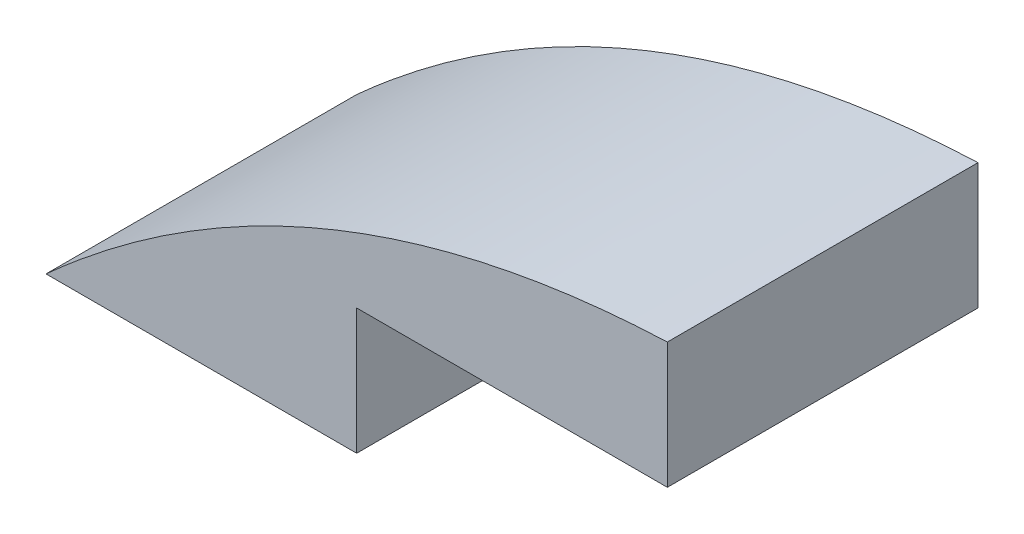
ISO-10303-21;
HEADER;
FILE_DESCRIPTION(('STEP AP214'),'2;1');
FILE_NAME('part.step','',(''),(''),'','','');
FILE_SCHEMA(('AUTOMOTIVE_DESIGN { 1 0 10303 214 1 1 1 1 }'));
ENDSEC;
DATA;
#1=APPLICATION_CONTEXT('core data for automotive mechanical design processes');
#2=APPLICATION_PROTOCOL_DEFINITION('international standard','automotive_design',2000,#1);
#3=PRODUCT_CONTEXT('',#1,'mechanical');
#4=PRODUCT('Part','Part','',(#3));
#5=PRODUCT_RELATED_PRODUCT_CATEGORY('part','',(#4));
#6=PRODUCT_DEFINITION_FORMATION('','',#4);
#7=PRODUCT_DEFINITION_CONTEXT('part definition',#1,'design');
#8=PRODUCT_DEFINITION('design','',#6,#7);
#9=PRODUCT_DEFINITION_SHAPE('','',#8);
#10=(LENGTH_UNIT() NAMED_UNIT(*) SI_UNIT(.MILLI.,.METRE.));
#11=(NAMED_UNIT(*) PLANE_ANGLE_UNIT() SI_UNIT($,.RADIAN.));
#12=(NAMED_UNIT(*) SI_UNIT($,.STERADIAN.) SOLID_ANGLE_UNIT());
#13=UNCERTAINTY_MEASURE_WITH_UNIT(LENGTH_MEASURE(1.E-05),#10,'distance_accuracy_value','');
#14=(GEOMETRIC_REPRESENTATION_CONTEXT(3) GLOBAL_UNCERTAINTY_ASSIGNED_CONTEXT((#13)) GLOBAL_UNIT_ASSIGNED_CONTEXT((#10,
#11,#12)) REPRESENTATION_CONTEXT('',''));
#15=CARTESIAN_POINT('',(0.,0.,0.));
#16=DIRECTION('',(0.,0.,1.));
#17=DIRECTION('',(1.,0.,0.));
#18=AXIS2_PLACEMENT_3D('',#15,#16,#17);
#19=CARTESIAN_POINT('',(0.,3.2,0.));
#20=DIRECTION('',(0.,0.,-1.));
#21=DIRECTION('',(-1.,0.,0.));
#22=AXIS2_PLACEMENT_3D('',#19,#20,#21);
#23=PLANE('',#22);
#24=DIRECTION('',(0.,-1.,0.));
#25=VECTOR('',#24,1.);
#26=CARTESIAN_POINT('',(15.8,6.4,0.));
#27=LINE('',#26,#25);
#28=CARTESIAN_POINT('',(15.8,6.4,0.));
#29=VERTEX_POINT('',#28);
#30=CARTESIAN_POINT('',(15.8,3.2,0.));
#31=VERTEX_POINT('',#30);
#32=EDGE_CURVE('E102',#29,#31,#27,.T.);
#33=ORIENTED_EDGE('',*,*,#32,.F.);
#34=CARTESIAN_POINT('',(15.8,6.4,0.));
#35=CARTESIAN_POINT('',(6.68464775292053,6.04266572904204,0.));
#36=CARTESIAN_POINT('',(0.,0.,0.));
#37=B_SPLINE_CURVE_WITH_KNOTS('',2,(#34,#35,#36),.UNSPECIFIED.,.F.,.F.,(3,3),(0.,1.),.UNSPECIFIED.);
#38=CARTESIAN_POINT('',(0.,0.,0.));
#39=VERTEX_POINT('',#38);
#40=EDGE_CURVE('E89',#29,#39,#37,.T.);
#41=ORIENTED_EDGE('',*,*,#40,.T.);
#42=DIRECTION('',(1.,0.,0.));
#43=VECTOR('',#42,1.);
#44=CARTESIAN_POINT('',(0.,0.,0.));
#45=LINE('',#44,#43);
#46=CARTESIAN_POINT('',(7.9,0.,0.));
#47=VERTEX_POINT('',#46);
#48=EDGE_CURVE('E101',#39,#47,#45,.T.);
#49=ORIENTED_EDGE('',*,*,#48,.T.);
#50=DIRECTION('',(0.,-1.,0.));
#51=VECTOR('',#50,1.);
#52=CARTESIAN_POINT('',(7.9,3.2,0.));
#53=LINE('',#52,#51);
#54=CARTESIAN_POINT('',(7.9,3.2,0.));
#55=VERTEX_POINT('',#54);
#56=EDGE_CURVE('E11',#55,#47,#53,.T.);
#57=ORIENTED_EDGE('',*,*,#56,.F.);
#58=DIRECTION('',(1.,0.,0.));
#59=VECTOR('',#58,1.);
#60=CARTESIAN_POINT('',(7.9,3.2,0.));
#61=LINE('',#60,#59);
#62=EDGE_CURVE('E49',#55,#31,#61,.T.);
#63=ORIENTED_EDGE('',*,*,#62,.T.);
#64=EDGE_LOOP('',(#33,#41,#49,#57,#63));
#65=FACE_BOUND('',#64,.T.);
#66=ADVANCED_FACE('F33',(#65),#23,.F.);
#67=CARTESIAN_POINT('',(7.9,3.2,0.));
#68=DIRECTION('',(-1.,0.,0.));
#69=DIRECTION('',(0.,0.,1.));
#70=AXIS2_PLACEMENT_3D('',#67,#68,#69);
#71=PLANE('',#70);
#72=DIRECTION('',(0.,-1.,0.));
#73=VECTOR('',#72,1.);
#74=CARTESIAN_POINT('',(7.9,3.2,-7.9));
#75=LINE('',#74,#73);
#76=CARTESIAN_POINT('',(7.9,3.2,-7.9));
#77=VERTEX_POINT('',#76);
#78=CARTESIAN_POINT('',(7.9,0.,-7.9));
#79=VERTEX_POINT('',#78);
#80=EDGE_CURVE('E41',#77,#79,#75,.T.);
#81=ORIENTED_EDGE('',*,*,#80,.F.);
#82=DIRECTION('',(0.,0.,1.));
#83=VECTOR('',#82,1.);
#84=CARTESIAN_POINT('',(7.9,3.2,-7.9));
#85=LINE('',#84,#83);
#86=EDGE_CURVE('E123',#77,#55,#85,.T.);
#87=ORIENTED_EDGE('',*,*,#86,.T.);
#88=ORIENTED_EDGE('',*,*,#56,.T.);
#89=DIRECTION('',(0.,0.,-1.));
#90=VECTOR('',#89,1.);
#91=CARTESIAN_POINT('',(7.9,0.,0.));
#92=LINE('',#91,#90);
#93=EDGE_CURVE('E96',#47,#79,#92,.T.);
#94=ORIENTED_EDGE('',*,*,#93,.T.);
#95=EDGE_LOOP('',(#81,#87,#88,#94));
#96=FACE_BOUND('',#95,.T.);
#97=ADVANCED_FACE('F157',(#96),#71,.F.);
#98=CARTESIAN_POINT('',(0.,3.2,-7.9));
#99=DIRECTION('',(0.,0.,1.));
#100=DIRECTION('',(1.,0.,0.));
#101=AXIS2_PLACEMENT_3D('',#98,#99,#100);
#102=PLANE('',#101);
#103=DIRECTION('',(-1.,0.,0.));
#104=VECTOR('',#103,1.);
#105=CARTESIAN_POINT('',(0.,0.,-7.9));
#106=LINE('',#105,#104);
#107=CARTESIAN_POINT('',(0.,0.,-7.9));
#108=VERTEX_POINT('',#107);
#109=EDGE_CURVE('E92',#79,#108,#106,.T.);
#110=ORIENTED_EDGE('',*,*,#109,.T.);
#111=CARTESIAN_POINT('',(15.8,6.4,-7.9));
#112=CARTESIAN_POINT('',(6.68464775292053,6.04266572904204,-7.9));
#113=CARTESIAN_POINT('',(0.,0.,-7.9));
#114=B_SPLINE_CURVE_WITH_KNOTS('',2,(#111,#112,#113),.UNSPECIFIED.,.F.,.F.,(3,3),(0.,1.),.UNSPECIFIED.);
#115=CARTESIAN_POINT('',(15.8,6.4,-7.9));
#116=VERTEX_POINT('',#115);
#117=EDGE_CURVE('E80',#116,#108,#114,.T.);
#118=ORIENTED_EDGE('',*,*,#117,.F.);
#119=DIRECTION('',(0.,-1.,0.));
#120=VECTOR('',#119,1.);
#121=CARTESIAN_POINT('',(15.8,6.4,-7.9));
#122=LINE('',#121,#120);
#123=CARTESIAN_POINT('',(15.8,3.2,-7.9));
#124=VERTEX_POINT('',#123);
#125=EDGE_CURVE('E105',#116,#124,#122,.T.);
#126=ORIENTED_EDGE('',*,*,#125,.T.);
#127=DIRECTION('',(-1.,0.,0.));
#128=VECTOR('',#127,1.);
#129=CARTESIAN_POINT('',(7.9,3.2,-7.9));
#130=LINE('',#129,#128);
#131=EDGE_CURVE('E113',#124,#77,#130,.T.);
#132=ORIENTED_EDGE('',*,*,#131,.T.);
#133=ORIENTED_EDGE('',*,*,#80,.T.);
#134=EDGE_LOOP('',(#110,#118,#126,#132,#133));
#135=FACE_BOUND('',#134,.T.);
#136=ADVANCED_FACE('F93',(#135),#102,.F.);
#137=CARTESIAN_POINT('',(0.,0.,0.));
#138=DIRECTION('',(0.,-1.,0.));
#139=DIRECTION('',(0.,0.,-1.));
#140=AXIS2_PLACEMENT_3D('',#137,#138,#139);
#141=PLANE('',#140);
#142=DIRECTION('',(0.,0.,1.));
#143=VECTOR('',#142,1.);
#144=CARTESIAN_POINT('',(0.,0.,0.));
#145=LINE('',#144,#143);
#146=EDGE_CURVE('E83',#108,#39,#145,.T.);
#147=ORIENTED_EDGE('',*,*,#146,.F.);
#148=ORIENTED_EDGE('',*,*,#109,.F.);
#149=ORIENTED_EDGE('',*,*,#93,.F.);
#150=ORIENTED_EDGE('',*,*,#48,.F.);
#151=EDGE_LOOP('',(#147,#148,#149,#150));
#152=FACE_BOUND('',#151,.T.);
#153=ADVANCED_FACE('F99',(#152),#141,.T.);
#154=CARTESIAN_POINT('',(15.8,6.4,-7.9));
#155=DIRECTION('',(-1.,0.,0.));
#156=DIRECTION('',(0.,0.,1.));
#157=AXIS2_PLACEMENT_3D('',#154,#155,#156);
#158=PLANE('',#157);
#159=DIRECTION('',(0.,0.,-1.));
#160=VECTOR('',#159,1.);
#161=CARTESIAN_POINT('',(15.8,3.2,-7.9));
#162=LINE('',#161,#160);
#163=EDGE_CURVE('E120',#31,#124,#162,.T.);
#164=ORIENTED_EDGE('',*,*,#163,.T.);
#165=ORIENTED_EDGE('',*,*,#125,.F.);
#166=DIRECTION('',(0.,0.,-1.));
#167=VECTOR('',#166,1.);
#168=CARTESIAN_POINT('',(15.8,6.4,-7.9));
#169=LINE('',#168,#167);
#170=EDGE_CURVE('E86',#29,#116,#169,.T.);
#171=ORIENTED_EDGE('',*,*,#170,.F.);
#172=ORIENTED_EDGE('',*,*,#32,.T.);
#173=EDGE_LOOP('',(#164,#165,#171,#172));
#174=FACE_BOUND('',#173,.T.);
#175=ADVANCED_FACE('F150',(#174),#158,.F.);
#176=CARTESIAN_POINT('',(0.,3.2,0.));
#177=DIRECTION('',(0.,1.,0.));
#178=DIRECTION('',(0.,0.,1.));
#179=AXIS2_PLACEMENT_3D('',#176,#177,#178);
#180=PLANE('',#179);
#181=ORIENTED_EDGE('',*,*,#86,.F.);
#182=ORIENTED_EDGE('',*,*,#131,.F.);
#183=ORIENTED_EDGE('',*,*,#163,.F.);
#184=ORIENTED_EDGE('',*,*,#62,.F.);
#185=EDGE_LOOP('',(#181,#182,#183,#184));
#186=FACE_BOUND('',#185,.T.);
#187=ADVANCED_FACE('F147',(#186),#180,.F.);
#188=CARTESIAN_POINT('',(15.8,6.4,0.3));
#189=CARTESIAN_POINT('',(6.68464775292053,6.04266572904204,0.3));
#190=CARTESIAN_POINT('',(0.,0.,0.3));
#191=B_SPLINE_CURVE_WITH_KNOTS('',2,(#188,#189,#190),.UNSPECIFIED.,.F.,.F.,(3,3),(0.,1.),.UNSPECIFIED.);
#192=DIRECTION('',(0.,0.,-1.));
#193=VECTOR('',#192,1.);
#194=SURFACE_OF_LINEAR_EXTRUSION('',#191,#193);
#195=ORIENTED_EDGE('',*,*,#170,.T.);
#196=ORIENTED_EDGE('',*,*,#117,.T.);
#197=ORIENTED_EDGE('',*,*,#146,.T.);
#198=ORIENTED_EDGE('',*,*,#40,.F.);
#199=EDGE_LOOP('',(#195,#196,#197,#198));
#200=FACE_BOUND('',#199,.T.);
#201=ADVANCED_FACE('F81',(#200),#194,.F.);
#202=CLOSED_SHELL('',(#66,#97,#136,#153,#175,#187,#201));
#203=MANIFOLD_SOLID_BREP('B2',#202);
#204=ADVANCED_BREP_SHAPE_REPRESENTATION('',(#18,#203),#14);
#205=SHAPE_DEFINITION_REPRESENTATION(#9,#204);
ENDSEC;
END-ISO-10303-21;
